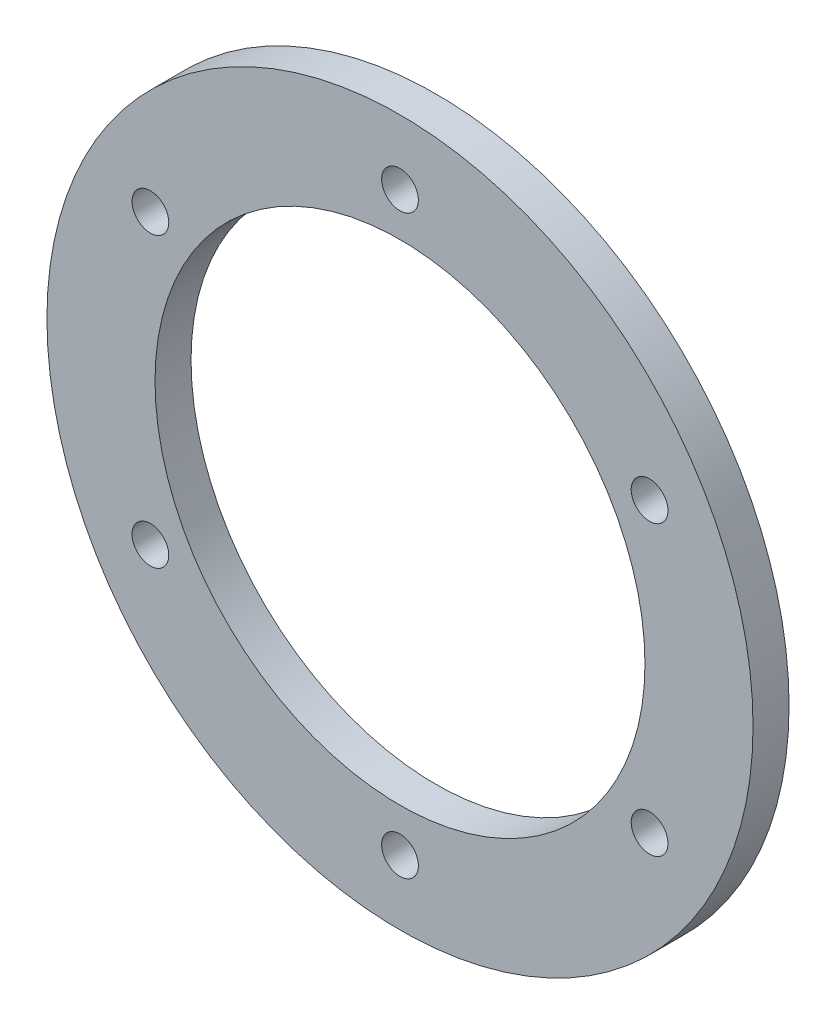
ISO-10303-21;
HEADER;
FILE_DESCRIPTION(('STEP AP214'),'2;1');
FILE_NAME('part.step','',(''),(''),'','','');
FILE_SCHEMA(('AUTOMOTIVE_DESIGN { 1 0 10303 214 1 1 1 1 }'));
ENDSEC;
DATA;
#1=APPLICATION_CONTEXT('core data for automotive mechanical design processes');
#2=APPLICATION_PROTOCOL_DEFINITION('international standard','automotive_design',2000,#1);
#3=PRODUCT_CONTEXT('',#1,'mechanical');
#4=PRODUCT('Part','Part','',(#3));
#5=PRODUCT_RELATED_PRODUCT_CATEGORY('part','',(#4));
#6=PRODUCT_DEFINITION_FORMATION('','',#4);
#7=PRODUCT_DEFINITION_CONTEXT('part definition',#1,'design');
#8=PRODUCT_DEFINITION('design','',#6,#7);
#9=PRODUCT_DEFINITION_SHAPE('','',#8);
#10=(LENGTH_UNIT() NAMED_UNIT(*) SI_UNIT(.MILLI.,.METRE.));
#11=(NAMED_UNIT(*) PLANE_ANGLE_UNIT() SI_UNIT($,.RADIAN.));
#12=(NAMED_UNIT(*) SI_UNIT($,.STERADIAN.) SOLID_ANGLE_UNIT());
#13=UNCERTAINTY_MEASURE_WITH_UNIT(LENGTH_MEASURE(1.E-05),#10,'distance_accuracy_value','');
#14=(GEOMETRIC_REPRESENTATION_CONTEXT(3) GLOBAL_UNCERTAINTY_ASSIGNED_CONTEXT((#13)) GLOBAL_UNIT_ASSIGNED_CONTEXT((#10,
#11,#12)) REPRESENTATION_CONTEXT('',''));
#15=CARTESIAN_POINT('',(0.,0.,0.));
#16=DIRECTION('',(0.,0.,1.));
#17=DIRECTION('',(1.,0.,0.));
#18=AXIS2_PLACEMENT_3D('',#15,#16,#17);
#19=CARTESIAN_POINT('',(0.,0.,5.));
#20=DIRECTION('',(0.,0.,1.));
#21=DIRECTION('',(1.,0.,0.));
#22=AXIS2_PLACEMENT_3D('',#19,#20,#21);
#23=PLANE('',#22);
#24=CARTESIAN_POINT('',(0.,40.,5.));
#25=DIRECTION('',(0.,0.,1.));
#26=DIRECTION('',(1.,0.,0.));
#27=AXIS2_PLACEMENT_3D('',#24,#25,#26);
#28=CIRCLE('',#27,2.55000000000629);
#29=CARTESIAN_POINT('',(2.55000000000629,40.,5.));
#30=VERTEX_POINT('',#29);
#31=EDGE_CURVE('E60',#30,#30,#28,.T.);
#32=ORIENTED_EDGE('',*,*,#31,.F.);
#33=EDGE_LOOP('',(#32));
#34=FACE_BOUND('',#33,.T.);
#35=CARTESIAN_POINT('',(-34.641016151376,19.9999999999972,5.));
#36=DIRECTION('',(0.,0.,1.));
#37=DIRECTION('',(1.,0.,0.));
#38=AXIS2_PLACEMENT_3D('',#35,#36,#37);
#39=CIRCLE('',#38,2.5500000000063);
#40=CARTESIAN_POINT('',(-32.0910161513697,19.9999999999972,5.));
#41=VERTEX_POINT('',#40);
#42=EDGE_CURVE('E98',#41,#41,#39,.T.);
#43=ORIENTED_EDGE('',*,*,#42,.F.);
#44=EDGE_LOOP('',(#43));
#45=FACE_BOUND('',#44,.T.);
#46=CARTESIAN_POINT('',(-34.6410161513728,-20.0000000000028,5.));
#47=DIRECTION('',(0.,0.,1.));
#48=DIRECTION('',(1.,0.,0.));
#49=AXIS2_PLACEMENT_3D('',#46,#47,#48);
#50=CIRCLE('',#49,2.55000000000629);
#51=CARTESIAN_POINT('',(-32.0910161513665,-20.0000000000028,5.));
#52=VERTEX_POINT('',#51);
#53=EDGE_CURVE('E64',#52,#52,#50,.T.);
#54=ORIENTED_EDGE('',*,*,#53,.F.);
#55=EDGE_LOOP('',(#54));
#56=FACE_BOUND('',#55,.T.);
#57=CARTESIAN_POINT('',(6.37773956665284E-12,-40.,5.));
#58=DIRECTION('',(0.,0.,1.));
#59=DIRECTION('',(1.,0.,0.));
#60=AXIS2_PLACEMENT_3D('',#57,#58,#59);
#61=CIRCLE('',#60,2.55000000000629);
#62=CARTESIAN_POINT('',(2.55000000001267,-40.,5.));
#63=VERTEX_POINT('',#62);
#64=EDGE_CURVE('E73',#63,#63,#61,.T.);
#65=ORIENTED_EDGE('',*,*,#64,.F.);
#66=EDGE_LOOP('',(#65));
#67=FACE_BOUND('',#66,.T.);
#68=CARTESIAN_POINT('',(34.6410161513823,-19.9999999999972,5.));
#69=DIRECTION('',(0.,0.,1.));
#70=DIRECTION('',(1.,0.,0.));
#71=AXIS2_PLACEMENT_3D('',#68,#69,#70);
#72=CIRCLE('',#71,2.5500000000063);
#73=CARTESIAN_POINT('',(37.1910161513886,-19.9999999999972,5.));
#74=VERTEX_POINT('',#73);
#75=EDGE_CURVE('E81',#74,#74,#72,.T.);
#76=ORIENTED_EDGE('',*,*,#75,.F.);
#77=EDGE_LOOP('',(#76));
#78=FACE_BOUND('',#77,.T.);
#79=CARTESIAN_POINT('',(34.6410161513791,20.0000000000028,5.));
#80=DIRECTION('',(0.,0.,1.));
#81=DIRECTION('',(1.,0.,0.));
#82=AXIS2_PLACEMENT_3D('',#79,#80,#81);
#83=CIRCLE('',#82,2.55000000000629);
#84=CARTESIAN_POINT('',(37.1910161513854,20.0000000000028,5.));
#85=VERTEX_POINT('',#84);
#86=EDGE_CURVE('E89',#85,#85,#83,.T.);
#87=ORIENTED_EDGE('',*,*,#86,.F.);
#88=EDGE_LOOP('',(#87));
#89=FACE_BOUND('',#88,.T.);
#90=CARTESIAN_POINT('',(0.,0.,5.));
#91=DIRECTION('',(0.,0.,1.));
#92=DIRECTION('',(1.,0.,0.));
#93=AXIS2_PLACEMENT_3D('',#90,#91,#92);
#94=CIRCLE('',#93,49.);
#95=CARTESIAN_POINT('',(49.,0.,5.));
#96=VERTEX_POINT('',#95);
#97=EDGE_CURVE('E10',#96,#96,#94,.T.);
#98=ORIENTED_EDGE('',*,*,#97,.T.);
#99=EDGE_LOOP('',(#98));
#100=FACE_BOUND('',#99,.T.);
#101=CARTESIAN_POINT('',(0.,0.,5.));
#102=DIRECTION('',(0.,0.,1.));
#103=DIRECTION('',(1.,0.,0.));
#104=AXIS2_PLACEMENT_3D('',#101,#102,#103);
#105=CIRCLE('',#104,34.);
#106=CARTESIAN_POINT('',(34.,0.,5.));
#107=VERTEX_POINT('',#106);
#108=EDGE_CURVE('E54',#107,#107,#105,.T.);
#109=ORIENTED_EDGE('',*,*,#108,.F.);
#110=EDGE_LOOP('',(#109));
#111=FACE_BOUND('',#110,.T.);
#112=ADVANCED_FACE('F41',(#34,#45,#56,#67,#78,#89,#100,#111),#23,.T.);
#113=CARTESIAN_POINT('',(0.,0.,0.));
#114=DIRECTION('',(0.,0.,1.));
#115=DIRECTION('',(1.,0.,0.));
#116=AXIS2_PLACEMENT_3D('',#113,#114,#115);
#117=PLANE('',#116);
#118=CARTESIAN_POINT('',(0.,40.,0.));
#119=DIRECTION('',(0.,0.,1.));
#120=DIRECTION('',(1.,0.,0.));
#121=AXIS2_PLACEMENT_3D('',#118,#119,#120);
#122=CIRCLE('',#121,2.55000000000629);
#123=CARTESIAN_POINT('',(2.55000000000629,40.,0.));
#124=VERTEX_POINT('',#123);
#125=EDGE_CURVE('E97',#124,#124,#122,.T.);
#126=ORIENTED_EDGE('',*,*,#125,.T.);
#127=EDGE_LOOP('',(#126));
#128=FACE_BOUND('',#127,.T.);
#129=CARTESIAN_POINT('',(-34.641016151376,19.9999999999972,0.));
#130=DIRECTION('',(0.,0.,1.));
#131=DIRECTION('',(1.,0.,0.));
#132=AXIS2_PLACEMENT_3D('',#129,#130,#131);
#133=CIRCLE('',#132,2.5500000000063);
#134=CARTESIAN_POINT('',(-32.0910161513697,19.9999999999972,0.));
#135=VERTEX_POINT('',#134);
#136=EDGE_CURVE('E69',#135,#135,#133,.T.);
#137=ORIENTED_EDGE('',*,*,#136,.T.);
#138=EDGE_LOOP('',(#137));
#139=FACE_BOUND('',#138,.T.);
#140=CARTESIAN_POINT('',(-34.6410161513728,-20.0000000000028,0.));
#141=DIRECTION('',(0.,0.,1.));
#142=DIRECTION('',(1.,0.,0.));
#143=AXIS2_PLACEMENT_3D('',#140,#141,#142);
#144=CIRCLE('',#143,2.55000000000629);
#145=CARTESIAN_POINT('',(-32.0910161513665,-20.0000000000028,0.));
#146=VERTEX_POINT('',#145);
#147=EDGE_CURVE('E68',#146,#146,#144,.T.);
#148=ORIENTED_EDGE('',*,*,#147,.T.);
#149=EDGE_LOOP('',(#148));
#150=FACE_BOUND('',#149,.T.);
#151=CARTESIAN_POINT('',(6.37773956665284E-12,-40.,0.));
#152=DIRECTION('',(0.,0.,1.));
#153=DIRECTION('',(1.,0.,0.));
#154=AXIS2_PLACEMENT_3D('',#151,#152,#153);
#155=CIRCLE('',#154,2.55000000000629);
#156=CARTESIAN_POINT('',(2.55000000001267,-40.,0.));
#157=VERTEX_POINT('',#156);
#158=EDGE_CURVE('E77',#157,#157,#155,.T.);
#159=ORIENTED_EDGE('',*,*,#158,.T.);
#160=EDGE_LOOP('',(#159));
#161=FACE_BOUND('',#160,.T.);
#162=CARTESIAN_POINT('',(34.6410161513823,-19.9999999999972,0.));
#163=DIRECTION('',(0.,0.,1.));
#164=DIRECTION('',(1.,0.,0.));
#165=AXIS2_PLACEMENT_3D('',#162,#163,#164);
#166=CIRCLE('',#165,2.5500000000063);
#167=CARTESIAN_POINT('',(37.1910161513886,-19.9999999999972,0.));
#168=VERTEX_POINT('',#167);
#169=EDGE_CURVE('E85',#168,#168,#166,.T.);
#170=ORIENTED_EDGE('',*,*,#169,.T.);
#171=EDGE_LOOP('',(#170));
#172=FACE_BOUND('',#171,.T.);
#173=CARTESIAN_POINT('',(34.6410161513791,20.0000000000028,0.));
#174=DIRECTION('',(0.,0.,1.));
#175=DIRECTION('',(1.,0.,0.));
#176=AXIS2_PLACEMENT_3D('',#173,#174,#175);
#177=CIRCLE('',#176,2.55000000000629);
#178=CARTESIAN_POINT('',(37.1910161513854,20.0000000000028,0.));
#179=VERTEX_POINT('',#178);
#180=EDGE_CURVE('E93',#179,#179,#177,.T.);
#181=ORIENTED_EDGE('',*,*,#180,.T.);
#182=EDGE_LOOP('',(#181));
#183=FACE_BOUND('',#182,.T.);
#184=CARTESIAN_POINT('',(0.,0.,0.));
#185=DIRECTION('',(0.,0.,1.));
#186=DIRECTION('',(1.,0.,0.));
#187=AXIS2_PLACEMENT_3D('',#184,#185,#186);
#188=CIRCLE('',#187,49.);
#189=CARTESIAN_POINT('',(49.,0.,0.));
#190=VERTEX_POINT('',#189);
#191=EDGE_CURVE('E45',#190,#190,#188,.T.);
#192=ORIENTED_EDGE('',*,*,#191,.F.);
#193=EDGE_LOOP('',(#192));
#194=FACE_BOUND('',#193,.T.);
#195=CARTESIAN_POINT('',(0.,0.,0.));
#196=DIRECTION('',(0.,0.,1.));
#197=DIRECTION('',(1.,0.,0.));
#198=AXIS2_PLACEMENT_3D('',#195,#196,#197);
#199=CIRCLE('',#198,34.);
#200=CARTESIAN_POINT('',(34.,0.,0.));
#201=VERTEX_POINT('',#200);
#202=EDGE_CURVE('E56',#201,#201,#199,.T.);
#203=ORIENTED_EDGE('',*,*,#202,.T.);
#204=EDGE_LOOP('',(#203));
#205=FACE_BOUND('',#204,.T.);
#206=ADVANCED_FACE('F117',(#128,#139,#150,#161,#172,#183,#194,#205),#117,.F.);
#207=CARTESIAN_POINT('',(0.,0.,5.));
#208=DIRECTION('',(0.,0.,-1.));
#209=DIRECTION('',(-1.,0.,0.));
#210=AXIS2_PLACEMENT_3D('',#207,#208,#209);
#211=CYLINDRICAL_SURFACE('',#210,49.);
#212=ORIENTED_EDGE('',*,*,#97,.F.);
#213=EDGE_LOOP('',(#212));
#214=FACE_BOUND('',#213,.T.);
#215=ORIENTED_EDGE('',*,*,#191,.T.);
#216=EDGE_LOOP('',(#215));
#217=FACE_BOUND('',#216,.T.);
#218=ADVANCED_FACE('F43',(#214,#217),#211,.T.);
#219=CARTESIAN_POINT('',(0.,0.,5.));
#220=DIRECTION('',(0.,0.,-1.));
#221=DIRECTION('',(-1.,0.,0.));
#222=AXIS2_PLACEMENT_3D('',#219,#220,#221);
#223=CYLINDRICAL_SURFACE('',#222,34.);
#224=ORIENTED_EDGE('',*,*,#108,.T.);
#225=EDGE_LOOP('',(#224));
#226=FACE_BOUND('',#225,.T.);
#227=ORIENTED_EDGE('',*,*,#202,.F.);
#228=EDGE_LOOP('',(#227));
#229=FACE_BOUND('',#228,.T.);
#230=ADVANCED_FACE('F131',(#226,#229),#223,.F.);
#231=CARTESIAN_POINT('',(34.6410161513791,20.0000000000028,5.));
#232=DIRECTION('',(0.,0.,-1.));
#233=DIRECTION('',(-1.,0.,0.));
#234=AXIS2_PLACEMENT_3D('',#231,#232,#233);
#235=CYLINDRICAL_SURFACE('',#234,2.55000000000629);
#236=ORIENTED_EDGE('',*,*,#86,.T.);
#237=EDGE_LOOP('',(#236));
#238=FACE_BOUND('',#237,.T.);
#239=ORIENTED_EDGE('',*,*,#180,.F.);
#240=EDGE_LOOP('',(#239));
#241=FACE_BOUND('',#240,.T.);
#242=ADVANCED_FACE('F134',(#238,#241),#235,.F.);
#243=CARTESIAN_POINT('',(34.6410161513823,-19.9999999999972,5.));
#244=DIRECTION('',(0.,0.,-1.));
#245=DIRECTION('',(-1.,0.,0.));
#246=AXIS2_PLACEMENT_3D('',#243,#244,#245);
#247=CYLINDRICAL_SURFACE('',#246,2.5500000000063);
#248=ORIENTED_EDGE('',*,*,#75,.T.);
#249=EDGE_LOOP('',(#248));
#250=FACE_BOUND('',#249,.T.);
#251=ORIENTED_EDGE('',*,*,#169,.F.);
#252=EDGE_LOOP('',(#251));
#253=FACE_BOUND('',#252,.T.);
#254=ADVANCED_FACE('F154',(#250,#253),#247,.F.);
#255=CARTESIAN_POINT('',(6.37773956665284E-12,-40.,5.));
#256=DIRECTION('',(0.,0.,-1.));
#257=DIRECTION('',(-1.,0.,0.));
#258=AXIS2_PLACEMENT_3D('',#255,#256,#257);
#259=CYLINDRICAL_SURFACE('',#258,2.55000000000629);
#260=ORIENTED_EDGE('',*,*,#64,.T.);
#261=EDGE_LOOP('',(#260));
#262=FACE_BOUND('',#261,.T.);
#263=ORIENTED_EDGE('',*,*,#158,.F.);
#264=EDGE_LOOP('',(#263));
#265=FACE_BOUND('',#264,.T.);
#266=ADVANCED_FACE('F150',(#262,#265),#259,.F.);
#267=CARTESIAN_POINT('',(-34.6410161513728,-20.0000000000028,5.));
#268=DIRECTION('',(0.,0.,-1.));
#269=DIRECTION('',(-1.,0.,0.));
#270=AXIS2_PLACEMENT_3D('',#267,#268,#269);
#271=CYLINDRICAL_SURFACE('',#270,2.55000000000629);
#272=ORIENTED_EDGE('',*,*,#53,.T.);
#273=EDGE_LOOP('',(#272));
#274=FACE_BOUND('',#273,.T.);
#275=ORIENTED_EDGE('',*,*,#147,.F.);
#276=EDGE_LOOP('',(#275));
#277=FACE_BOUND('',#276,.T.);
#278=ADVANCED_FACE('F146',(#274,#277),#271,.F.);
#279=CARTESIAN_POINT('',(-34.641016151376,19.9999999999972,5.));
#280=DIRECTION('',(0.,0.,-1.));
#281=DIRECTION('',(-1.,0.,0.));
#282=AXIS2_PLACEMENT_3D('',#279,#280,#281);
#283=CYLINDRICAL_SURFACE('',#282,2.5500000000063);
#284=ORIENTED_EDGE('',*,*,#42,.T.);
#285=EDGE_LOOP('',(#284));
#286=FACE_BOUND('',#285,.T.);
#287=ORIENTED_EDGE('',*,*,#136,.F.);
#288=EDGE_LOOP('',(#287));
#289=FACE_BOUND('',#288,.T.);
#290=ADVANCED_FACE('F149',(#286,#289),#283,.F.);
#291=CARTESIAN_POINT('',(0.,40.,5.));
#292=DIRECTION('',(0.,0.,-1.));
#293=DIRECTION('',(-1.,0.,0.));
#294=AXIS2_PLACEMENT_3D('',#291,#292,#293);
#295=CYLINDRICAL_SURFACE('',#294,2.55000000000629);
#296=ORIENTED_EDGE('',*,*,#31,.T.);
#297=EDGE_LOOP('',(#296));
#298=FACE_BOUND('',#297,.T.);
#299=ORIENTED_EDGE('',*,*,#125,.F.);
#300=EDGE_LOOP('',(#299));
#301=FACE_BOUND('',#300,.T.);
#302=ADVANCED_FACE('F112',(#298,#301),#295,.F.);
#303=CLOSED_SHELL('',(#112,#206,#218,#230,#242,#254,#266,#278,#290,#302));
#304=MANIFOLD_SOLID_BREP('B2',#303);
#305=ADVANCED_BREP_SHAPE_REPRESENTATION('',(#18,#304),#14);
#306=SHAPE_DEFINITION_REPRESENTATION(#9,#305);
ENDSEC;
END-ISO-10303-21;
